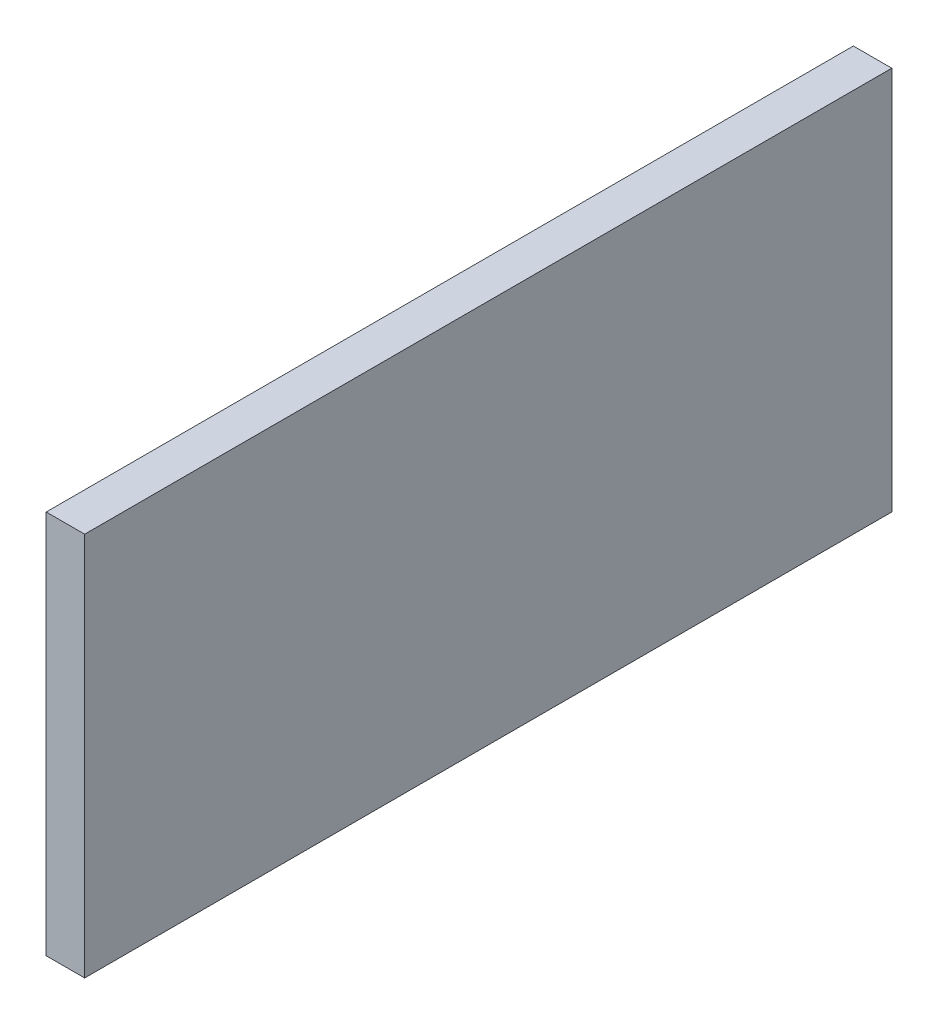
ISO-10303-21;
HEADER;
FILE_DESCRIPTION(('STEP AP214'),'2;1');
FILE_NAME('part.step','',(''),(''),'','','');
FILE_SCHEMA(('AUTOMOTIVE_DESIGN { 1 0 10303 214 1 1 1 1 }'));
ENDSEC;
DATA;
#1=APPLICATION_CONTEXT('core data for automotive mechanical design processes');
#2=APPLICATION_PROTOCOL_DEFINITION('international standard','automotive_design',2000,#1);
#3=PRODUCT_CONTEXT('',#1,'mechanical');
#4=PRODUCT('Part','Part','',(#3));
#5=PRODUCT_RELATED_PRODUCT_CATEGORY('part','',(#4));
#6=PRODUCT_DEFINITION_FORMATION('','',#4);
#7=PRODUCT_DEFINITION_CONTEXT('part definition',#1,'design');
#8=PRODUCT_DEFINITION('design','',#6,#7);
#9=PRODUCT_DEFINITION_SHAPE('','',#8);
#10=(LENGTH_UNIT() NAMED_UNIT(*) SI_UNIT(.MILLI.,.METRE.));
#11=(NAMED_UNIT(*) PLANE_ANGLE_UNIT() SI_UNIT($,.RADIAN.));
#12=(NAMED_UNIT(*) SI_UNIT($,.STERADIAN.) SOLID_ANGLE_UNIT());
#13=UNCERTAINTY_MEASURE_WITH_UNIT(LENGTH_MEASURE(1.E-05),#10,'distance_accuracy_value','');
#14=(GEOMETRIC_REPRESENTATION_CONTEXT(3) GLOBAL_UNCERTAINTY_ASSIGNED_CONTEXT((#13)) GLOBAL_UNIT_ASSIGNED_CONTEXT((#10,
#11,#12)) REPRESENTATION_CONTEXT('',''));
#15=CARTESIAN_POINT('',(0.,0.,0.));
#16=DIRECTION('',(0.,0.,1.));
#17=DIRECTION('',(1.,0.,0.));
#18=AXIS2_PLACEMENT_3D('',#15,#16,#17);
#19=CARTESIAN_POINT('',(100.,2000.,2100.));
#20=DIRECTION('',(-1.,0.,0.));
#21=DIRECTION('',(0.,0.,1.));
#22=AXIS2_PLACEMENT_3D('',#19,#20,#21);
#23=PLANE('',#22);
#24=DIRECTION('',(0.,0.,-1.));
#25=VECTOR('',#24,1.);
#26=CARTESIAN_POINT('',(100.,0.,2100.));
#27=LINE('',#26,#25);
#28=CARTESIAN_POINT('',(100.,0.,2100.));
#29=VERTEX_POINT('',#28);
#30=CARTESIAN_POINT('',(100.,0.,-2100.));
#31=VERTEX_POINT('',#30);
#32=EDGE_CURVE('E111',#29,#31,#27,.T.);
#33=ORIENTED_EDGE('',*,*,#32,.T.);
#34=DIRECTION('',(0.,-1.,0.));
#35=VECTOR('',#34,1.);
#36=CARTESIAN_POINT('',(100.,2000.,-2100.));
#37=LINE('',#36,#35);
#38=CARTESIAN_POINT('',(100.,2000.,-2100.));
#39=VERTEX_POINT('',#38);
#40=EDGE_CURVE('E11',#39,#31,#37,.T.);
#41=ORIENTED_EDGE('',*,*,#40,.F.);
#42=DIRECTION('',(0.,0.,-1.));
#43=VECTOR('',#42,1.);
#44=CARTESIAN_POINT('',(100.,2000.,2100.));
#45=LINE('',#44,#43);
#46=CARTESIAN_POINT('',(100.,2000.,2100.));
#47=VERTEX_POINT('',#46);
#48=EDGE_CURVE('E95',#47,#39,#45,.T.);
#49=ORIENTED_EDGE('',*,*,#48,.F.);
#50=DIRECTION('',(0.,-1.,0.));
#51=VECTOR('',#50,1.);
#52=CARTESIAN_POINT('',(100.,2000.,2100.));
#53=LINE('',#52,#51);
#54=EDGE_CURVE('E107',#47,#29,#53,.T.);
#55=ORIENTED_EDGE('',*,*,#54,.T.);
#56=EDGE_LOOP('',(#33,#41,#49,#55));
#57=FACE_BOUND('',#56,.T.);
#58=ADVANCED_FACE('F43',(#57),#23,.F.);
#59=CARTESIAN_POINT('',(-100.,2000.,-2100.));
#60=DIRECTION('',(0.,0.,1.));
#61=DIRECTION('',(1.,0.,0.));
#62=AXIS2_PLACEMENT_3D('',#59,#60,#61);
#63=PLANE('',#62);
#64=DIRECTION('',(-1.,0.,0.));
#65=VECTOR('',#64,1.);
#66=CARTESIAN_POINT('',(-100.,0.,-2100.));
#67=LINE('',#66,#65);
#68=CARTESIAN_POINT('',(-100.,0.,-2100.));
#69=VERTEX_POINT('',#68);
#70=EDGE_CURVE('E100',#31,#69,#67,.T.);
#71=ORIENTED_EDGE('',*,*,#70,.T.);
#72=DIRECTION('',(0.,-1.,0.));
#73=VECTOR('',#72,1.);
#74=CARTESIAN_POINT('',(-100.,2000.,-2100.));
#75=LINE('',#74,#73);
#76=CARTESIAN_POINT('',(-100.,2000.,-2100.));
#77=VERTEX_POINT('',#76);
#78=EDGE_CURVE('E52',#77,#69,#75,.T.);
#79=ORIENTED_EDGE('',*,*,#78,.F.);
#80=DIRECTION('',(-1.,0.,0.));
#81=VECTOR('',#80,1.);
#82=CARTESIAN_POINT('',(-100.,2000.,-2100.));
#83=LINE('',#82,#81);
#84=EDGE_CURVE('E90',#39,#77,#83,.T.);
#85=ORIENTED_EDGE('',*,*,#84,.F.);
#86=ORIENTED_EDGE('',*,*,#40,.T.);
#87=EDGE_LOOP('',(#71,#79,#85,#86));
#88=FACE_BOUND('',#87,.T.);
#89=ADVANCED_FACE('F99',(#88),#63,.F.);
#90=CARTESIAN_POINT('',(-100.,2000.,2100.));
#91=DIRECTION('',(1.,0.,0.));
#92=DIRECTION('',(0.,0.,-1.));
#93=AXIS2_PLACEMENT_3D('',#90,#91,#92);
#94=PLANE('',#93);
#95=DIRECTION('',(0.,0.,1.));
#96=VECTOR('',#95,1.);
#97=CARTESIAN_POINT('',(-100.,0.,2100.));
#98=LINE('',#97,#96);
#99=CARTESIAN_POINT('',(-100.,0.,2100.));
#100=VERTEX_POINT('',#99);
#101=EDGE_CURVE('E77',#69,#100,#98,.T.);
#102=ORIENTED_EDGE('',*,*,#101,.T.);
#103=DIRECTION('',(0.,-1.,0.));
#104=VECTOR('',#103,1.);
#105=CARTESIAN_POINT('',(-100.,2000.,2100.));
#106=LINE('',#105,#104);
#107=CARTESIAN_POINT('',(-100.,2000.,2100.));
#108=VERTEX_POINT('',#107);
#109=EDGE_CURVE('E102',#108,#100,#106,.T.);
#110=ORIENTED_EDGE('',*,*,#109,.F.);
#111=DIRECTION('',(0.,0.,1.));
#112=VECTOR('',#111,1.);
#113=CARTESIAN_POINT('',(-100.,2000.,2100.));
#114=LINE('',#113,#112);
#115=EDGE_CURVE('E93',#77,#108,#114,.T.);
#116=ORIENTED_EDGE('',*,*,#115,.F.);
#117=ORIENTED_EDGE('',*,*,#78,.T.);
#118=EDGE_LOOP('',(#102,#110,#116,#117));
#119=FACE_BOUND('',#118,.T.);
#120=ADVANCED_FACE('F103',(#119),#94,.F.);
#121=CARTESIAN_POINT('',(-100.,2000.,2100.));
#122=DIRECTION('',(0.,0.,-1.));
#123=DIRECTION('',(-1.,0.,0.));
#124=AXIS2_PLACEMENT_3D('',#121,#122,#123);
#125=PLANE('',#124);
#126=DIRECTION('',(1.,0.,0.));
#127=VECTOR('',#126,1.);
#128=CARTESIAN_POINT('',(-100.,0.,2100.));
#129=LINE('',#128,#127);
#130=EDGE_CURVE('E83',#100,#29,#129,.T.);
#131=ORIENTED_EDGE('',*,*,#130,.T.);
#132=ORIENTED_EDGE('',*,*,#54,.F.);
#133=DIRECTION('',(1.,0.,0.));
#134=VECTOR('',#133,1.);
#135=CARTESIAN_POINT('',(-100.,2000.,2100.));
#136=LINE('',#135,#134);
#137=EDGE_CURVE('E60',#108,#47,#136,.T.);
#138=ORIENTED_EDGE('',*,*,#137,.F.);
#139=ORIENTED_EDGE('',*,*,#109,.T.);
#140=EDGE_LOOP('',(#131,#132,#138,#139));
#141=FACE_BOUND('',#140,.T.);
#142=ADVANCED_FACE('F124',(#141),#125,.F.);
#143=CARTESIAN_POINT('',(0.,2000.,0.));
#144=DIRECTION('',(0.,-1.,0.));
#145=DIRECTION('',(0.,0.,-1.));
#146=AXIS2_PLACEMENT_3D('',#143,#144,#145);
#147=PLANE('',#146);
#148=ORIENTED_EDGE('',*,*,#48,.T.);
#149=ORIENTED_EDGE('',*,*,#84,.T.);
#150=ORIENTED_EDGE('',*,*,#115,.T.);
#151=ORIENTED_EDGE('',*,*,#137,.T.);
#152=EDGE_LOOP('',(#148,#149,#150,#151));
#153=FACE_BOUND('',#152,.T.);
#154=ADVANCED_FACE('F91',(#153),#147,.F.);
#155=CARTESIAN_POINT('',(0.,0.,0.));
#156=DIRECTION('',(0.,-1.,0.));
#157=DIRECTION('',(0.,0.,-1.));
#158=AXIS2_PLACEMENT_3D('',#155,#156,#157);
#159=PLANE('',#158);
#160=ORIENTED_EDGE('',*,*,#32,.F.);
#161=ORIENTED_EDGE('',*,*,#130,.F.);
#162=ORIENTED_EDGE('',*,*,#101,.F.);
#163=ORIENTED_EDGE('',*,*,#70,.F.);
#164=EDGE_LOOP('',(#160,#161,#162,#163));
#165=FACE_BOUND('',#164,.T.);
#166=ADVANCED_FACE('F127',(#165),#159,.T.);
#167=CLOSED_SHELL('',(#58,#89,#120,#142,#154,#166));
#168=MANIFOLD_SOLID_BREP('B2',#167);
#169=ADVANCED_BREP_SHAPE_REPRESENTATION('',(#18,#168),#14);
#170=SHAPE_DEFINITION_REPRESENTATION(#9,#169);
ENDSEC;
END-ISO-10303-21;
